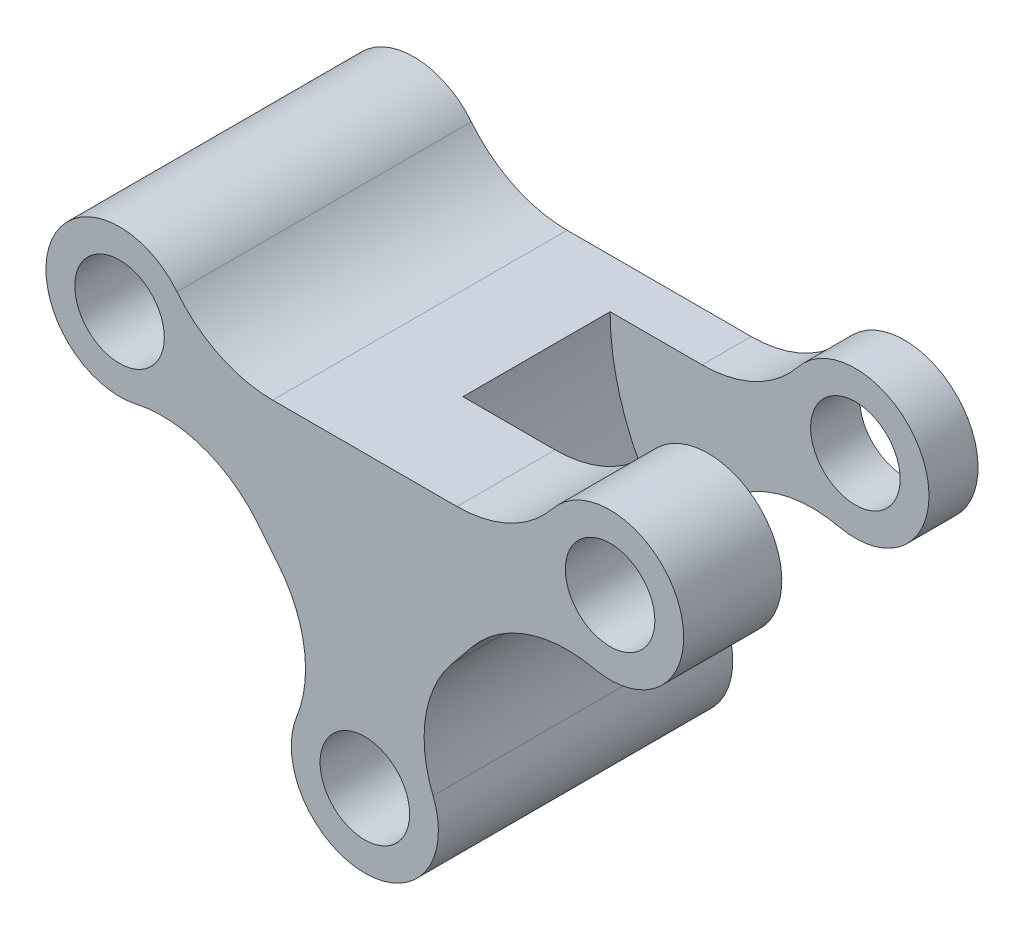
ISO-10303-21;
HEADER;
FILE_DESCRIPTION(('STEP AP214'),'2;1');
FILE_NAME('part.step','',(''),(''),'','','');
FILE_SCHEMA(('AUTOMOTIVE_DESIGN { 1 0 10303 214 1 1 1 1 }'));
ENDSEC;
DATA;
#1=APPLICATION_CONTEXT('core data for automotive mechanical design processes');
#2=APPLICATION_PROTOCOL_DEFINITION('international standard','automotive_design',2000,#1);
#3=PRODUCT_CONTEXT('',#1,'mechanical');
#4=PRODUCT('Part','Part','',(#3));
#5=PRODUCT_RELATED_PRODUCT_CATEGORY('part','',(#4));
#6=PRODUCT_DEFINITION_FORMATION('','',#4);
#7=PRODUCT_DEFINITION_CONTEXT('part definition',#1,'design');
#8=PRODUCT_DEFINITION('design','',#6,#7);
#9=PRODUCT_DEFINITION_SHAPE('','',#8);
#10=(LENGTH_UNIT() NAMED_UNIT(*) SI_UNIT(.MILLI.,.METRE.));
#11=(NAMED_UNIT(*) PLANE_ANGLE_UNIT() SI_UNIT($,.RADIAN.));
#12=(NAMED_UNIT(*) SI_UNIT($,.STERADIAN.) SOLID_ANGLE_UNIT());
#13=UNCERTAINTY_MEASURE_WITH_UNIT(LENGTH_MEASURE(1.E-05),#10,'distance_accuracy_value','');
#14=(GEOMETRIC_REPRESENTATION_CONTEXT(3) GLOBAL_UNCERTAINTY_ASSIGNED_CONTEXT((#13)) GLOBAL_UNIT_ASSIGNED_CONTEXT((#10,
#11,#12)) REPRESENTATION_CONTEXT('',''));
#15=CARTESIAN_POINT('',(0.,0.,0.));
#16=DIRECTION('',(0.,0.,1.));
#17=DIRECTION('',(1.,0.,0.));
#18=AXIS2_PLACEMENT_3D('',#15,#16,#17);
#19=CARTESIAN_POINT('',(2.45008972423379,-2.00294834956112,12.));
#20=DIRECTION('',(0.774215945384604,-0.632921535351914,0.));
#21=DIRECTION('',(0.632921535351914,0.774215945384604,0.));
#22=AXIS2_PLACEMENT_3D('',#19,#20,#21);
#23=PLANE('',#22);
#24=DIRECTION('',(-0.632921535351914,-0.774215945384604,0.));
#25=VECTOR('',#24,1.);
#26=CARTESIAN_POINT('',(2.45008972423379,-2.00294834956112,8.));
#27=LINE('',#26,#25);
#28=CARTESIAN_POINT('',(4.38022113462885,0.358068666212658,8.));
#29=VERTEX_POINT('',#28);
#30=CARTESIAN_POINT('',(3.54594958364345,-0.662446992485075,8.));
#31=VERTEX_POINT('',#30);
#32=EDGE_CURVE('E550',#29,#31,#27,.T.);
#33=ORIENTED_EDGE('',*,*,#32,.F.);
#34=DIRECTION('',(0.,0.,-1.));
#35=VECTOR('',#34,1.);
#36=CARTESIAN_POINT('',(4.38022113462885,0.358068666212658,12.));
#37=LINE('',#36,#35);
#38=CARTESIAN_POINT('',(4.38022113462885,0.358068666212658,12.));
#39=VERTEX_POINT('',#38);
#40=EDGE_CURVE('E430',#29,#39,#37,.F.);
#41=ORIENTED_EDGE('',*,*,#40,.T.);
#42=DIRECTION('',(-0.632921535351914,-0.774215945384604,0.));
#43=VECTOR('',#42,1.);
#44=CARTESIAN_POINT('',(2.45008972423379,-2.00294834956112,12.));
#45=LINE('',#44,#43);
#46=CARTESIAN_POINT('',(3.54594958364345,-0.662446992485075,12.));
#47=VERTEX_POINT('',#46);
#48=EDGE_CURVE('E521',#39,#47,#45,.T.);
#49=ORIENTED_EDGE('',*,*,#48,.T.);
#50=DIRECTION('',(0.,0.,-1.));
#51=VECTOR('',#50,1.);
#52=CARTESIAN_POINT('',(3.54594958364345,-0.662446992485075,12.));
#53=LINE('',#52,#51);
#54=EDGE_CURVE('E427',#47,#31,#53,.T.);
#55=ORIENTED_EDGE('',*,*,#54,.T.);
#56=EDGE_LOOP('',(#33,#41,#49,#55));
#57=FACE_BOUND('',#56,.T.);
#58=ADVANCED_FACE('F236',(#57),#23,.T.);
#59=CARTESIAN_POINT('',(10.,5.,12.));
#60=DIRECTION('',(0.,0.,-1.));
#61=DIRECTION('',(-1.,0.,0.));
#62=AXIS2_PLACEMENT_3D('',#59,#60,#61);
#63=CYLINDRICAL_SURFACE('',#62,1.825);
#64=CARTESIAN_POINT('',(10.,5.,0.));
#65=DIRECTION('',(0.,0.,1.));
#66=DIRECTION('',(1.,0.,0.));
#67=AXIS2_PLACEMENT_3D('',#64,#65,#66);
#68=CIRCLE('',#67,1.825);
#69=CARTESIAN_POINT('',(11.825,5.,0.));
#70=VERTEX_POINT('',#69);
#71=EDGE_CURVE('E511',#70,#70,#68,.T.);
#72=ORIENTED_EDGE('',*,*,#71,.F.);
#73=EDGE_LOOP('',(#72));
#74=FACE_BOUND('',#73,.T.);
#75=CARTESIAN_POINT('',(10.,5.,2.));
#76=DIRECTION('',(0.,0.,1.));
#77=DIRECTION('',(1.,0.,0.));
#78=AXIS2_PLACEMENT_3D('',#75,#76,#77);
#79=CIRCLE('',#78,1.825);
#80=CARTESIAN_POINT('',(11.825,5.,2.));
#81=VERTEX_POINT('',#80);
#82=EDGE_CURVE('E591',#81,#81,#79,.T.);
#83=ORIENTED_EDGE('',*,*,#82,.T.);
#84=EDGE_LOOP('',(#83));
#85=FACE_BOUND('',#84,.T.);
#86=ADVANCED_FACE('F619',(#74,#85),#63,.F.);
#87=CARTESIAN_POINT('',(10.,5.,12.));
#88=DIRECTION('',(0.,0.,-1.));
#89=DIRECTION('',(-1.,0.,0.));
#90=AXIS2_PLACEMENT_3D('',#87,#88,#89);
#91=CYLINDRICAL_SURFACE('',#90,3.);
#92=CARTESIAN_POINT('',(10.,5.,0.));
#93=DIRECTION('',(0.,0.,1.));
#94=DIRECTION('',(1.,0.,0.));
#95=AXIS2_PLACEMENT_3D('',#92,#93,#94);
#96=CIRCLE('',#95,3.);
#97=CARTESIAN_POINT('',(9.34423782308195,2.07254787104491,0.));
#98=VERTEX_POINT('',#97);
#99=CARTESIAN_POINT('',(7.6581257506006,6.875,0.));
#100=VERTEX_POINT('',#99);
#101=EDGE_CURVE('E475',#98,#100,#96,.T.);
#102=ORIENTED_EDGE('',*,*,#101,.T.);
#103=DIRECTION('',(0.,0.,-1.));
#104=VECTOR('',#103,1.);
#105=CARTESIAN_POINT('',(7.6581257506006,6.875,12.));
#106=LINE('',#105,#104);
#107=CARTESIAN_POINT('',(7.6581257506006,6.875,2.));
#108=VERTEX_POINT('',#107);
#109=EDGE_CURVE('E467',#100,#108,#106,.F.);
#110=ORIENTED_EDGE('',*,*,#109,.T.);
#111=CARTESIAN_POINT('',(10.,5.,2.));
#112=DIRECTION('',(0.,0.,1.));
#113=DIRECTION('',(1.,0.,0.));
#114=AXIS2_PLACEMENT_3D('',#111,#112,#113);
#115=CIRCLE('',#114,3.);
#116=CARTESIAN_POINT('',(9.34423782308195,2.07254787104491,2.));
#117=VERTEX_POINT('',#116);
#118=EDGE_CURVE('E399',#117,#108,#115,.T.);
#119=ORIENTED_EDGE('',*,*,#118,.F.);
#120=DIRECTION('',(0.,0.,-1.));
#121=VECTOR('',#120,1.);
#122=CARTESIAN_POINT('',(9.34423782308195,2.07254787104491,12.));
#123=LINE('',#122,#121);
#124=EDGE_CURVE('E464',#117,#98,#123,.T.);
#125=ORIENTED_EDGE('',*,*,#124,.T.);
#126=EDGE_LOOP('',(#102,#110,#119,#125));
#127=FACE_BOUND('',#126,.T.);
#128=ADVANCED_FACE('F481',(#127),#91,.T.);
#129=CARTESIAN_POINT('',(0.,0.,12.));
#130=DIRECTION('',(0.,0.,1.));
#131=DIRECTION('',(1.,0.,0.));
#132=AXIS2_PLACEMENT_3D('',#129,#130,#131);
#133=PLANE('',#132);
#134=CARTESIAN_POINT('',(-10.,5.,12.));
#135=DIRECTION('',(0.,0.,1.));
#136=DIRECTION('',(1.,0.,0.));
#137=AXIS2_PLACEMENT_3D('',#134,#135,#136);
#138=CIRCLE('',#137,1.825);
#139=CARTESIAN_POINT('',(-8.175,5.,12.));
#140=VERTEX_POINT('',#139);
#141=EDGE_CURVE('E516',#140,#140,#138,.T.);
#142=ORIENTED_EDGE('',*,*,#141,.F.);
#143=EDGE_LOOP('',(#142));
#144=FACE_BOUND('',#143,.T.);
#145=CARTESIAN_POINT('',(10.,5.,12.));
#146=DIRECTION('',(0.,0.,1.));
#147=DIRECTION('',(1.,0.,0.));
#148=AXIS2_PLACEMENT_3D('',#145,#146,#147);
#149=CIRCLE('',#148,1.825);
#150=CARTESIAN_POINT('',(11.825,5.,12.));
#151=VERTEX_POINT('',#150);
#152=EDGE_CURVE('E485',#151,#151,#149,.T.);
#153=ORIENTED_EDGE('',*,*,#152,.F.);
#154=EDGE_LOOP('',(#153));
#155=FACE_BOUND('',#154,.T.);
#156=CARTESIAN_POINT('',(0.,-6.825,12.));
#157=DIRECTION('',(0.,0.,1.));
#158=DIRECTION('',(1.,0.,0.));
#159=AXIS2_PLACEMENT_3D('',#156,#157,#158);
#160=CIRCLE('',#159,1.825);
#161=CARTESIAN_POINT('',(1.825,-6.825,12.));
#162=VERTEX_POINT('',#161);
#163=EDGE_CURVE('E491',#162,#162,#160,.T.);
#164=ORIENTED_EDGE('',*,*,#163,.F.);
#165=EDGE_LOOP('',(#164));
#166=FACE_BOUND('',#165,.T.);
#167=DIRECTION('',(-0.632921535351914,0.774215945384604,0.));
#168=VECTOR('',#167,1.);
#169=CARTESIAN_POINT('',(-2.45008972423379,-2.00294834956112,12.));
#170=LINE('',#169,#168);
#171=CARTESIAN_POINT('',(-3.54594958364345,-0.662446992485075,12.));
#172=VERTEX_POINT('',#171);
#173=CARTESIAN_POINT('',(-4.38022113462885,0.358068666212657,12.));
#174=VERTEX_POINT('',#173);
#175=EDGE_CURVE('E560',#172,#174,#170,.T.);
#176=ORIENTED_EDGE('',*,*,#175,.F.);
#177=CARTESIAN_POINT('',(-7.41702931056647,-3.82705466924464,12.));
#178=DIRECTION('',(0.,0.,1.));
#179=DIRECTION('',(1.,0.,0.));
#180=AXIS2_PLACEMENT_3D('',#177,#178,#179);
#181=CIRCLE('',#180,5.);
#182=CARTESIAN_POINT('',(-2.78138599146243,-5.70077050096674,12.));
#183=VERTEX_POINT('',#182);
#184=EDGE_CURVE('E442',#172,#183,#181,.F.);
#185=ORIENTED_EDGE('',*,*,#184,.T.);
#186=CARTESIAN_POINT('',(0.,-6.825,12.));
#187=DIRECTION('',(0.,0.,1.));
#188=DIRECTION('',(1.,0.,0.));
#189=AXIS2_PLACEMENT_3D('',#186,#187,#188);
#190=CIRCLE('',#189,3.);
#191=CARTESIAN_POINT('',(2.78138599146243,-5.70077050096674,12.));
#192=VERTEX_POINT('',#191);
#193=EDGE_CURVE('E525',#183,#192,#190,.T.);
#194=ORIENTED_EDGE('',*,*,#193,.T.);
#195=CARTESIAN_POINT('',(7.41702931056647,-3.82705466924464,12.));
#196=DIRECTION('',(0.,0.,1.));
#197=DIRECTION('',(1.,0.,0.));
#198=AXIS2_PLACEMENT_3D('',#195,#196,#197);
#199=CIRCLE('',#198,5.);
#200=EDGE_CURVE('E460',#192,#47,#199,.F.);
#201=ORIENTED_EDGE('',*,*,#200,.T.);
#202=ORIENTED_EDGE('',*,*,#48,.F.);
#203=CARTESIAN_POINT('',(8.25130086155187,-2.80653901054691,12.));
#204=DIRECTION('',(0.,0.,1.));
#205=DIRECTION('',(1.,0.,0.));
#206=AXIS2_PLACEMENT_3D('',#203,#204,#205);
#207=CIRCLE('',#206,5.);
#208=CARTESIAN_POINT('',(9.34423782308195,2.07254787104491,12.));
#209=VERTEX_POINT('',#208);
#210=EDGE_CURVE('E446',#39,#209,#207,.F.);
#211=ORIENTED_EDGE('',*,*,#210,.T.);
#212=CARTESIAN_POINT('',(10.,5.,12.));
#213=DIRECTION('',(0.,0.,1.));
#214=DIRECTION('',(1.,0.,0.));
#215=AXIS2_PLACEMENT_3D('',#212,#213,#214);
#216=CIRCLE('',#215,3.);
#217=CARTESIAN_POINT('',(7.6581257506006,6.875,12.));
#218=VERTEX_POINT('',#217);
#219=EDGE_CURVE('E484',#209,#218,#216,.T.);
#220=ORIENTED_EDGE('',*,*,#219,.T.);
#221=CARTESIAN_POINT('',(3.75500200160161,10.,12.));
#222=DIRECTION('',(0.,0.,1.));
#223=DIRECTION('',(1.,0.,0.));
#224=AXIS2_PLACEMENT_3D('',#221,#222,#223);
#225=CIRCLE('',#224,5.);
#226=CARTESIAN_POINT('',(3.75500200160161,5.,12.));
#227=VERTEX_POINT('',#226);
#228=EDGE_CURVE('E450',#218,#227,#225,.F.);
#229=ORIENTED_EDGE('',*,*,#228,.T.);
#230=DIRECTION('',(1.,0.,0.));
#231=VECTOR('',#230,1.);
#232=CARTESIAN_POINT('',(0.,5.,12.));
#233=LINE('',#232,#231);
#234=CARTESIAN_POINT('',(-3.7550020016016,5.,12.));
#235=VERTEX_POINT('',#234);
#236=EDGE_CURVE('E505',#235,#227,#233,.T.);
#237=ORIENTED_EDGE('',*,*,#236,.F.);
#238=CARTESIAN_POINT('',(-3.7550020016016,10.,12.));
#239=DIRECTION('',(0.,0.,1.));
#240=DIRECTION('',(1.,0.,0.));
#241=AXIS2_PLACEMENT_3D('',#238,#239,#240);
#242=CIRCLE('',#241,5.);
#243=CARTESIAN_POINT('',(-7.6581257506006,6.875,12.));
#244=VERTEX_POINT('',#243);
#245=EDGE_CURVE('E434',#235,#244,#242,.F.);
#246=ORIENTED_EDGE('',*,*,#245,.T.);
#247=CARTESIAN_POINT('',(-10.,5.,12.));
#248=DIRECTION('',(0.,0.,1.));
#249=DIRECTION('',(1.,0.,0.));
#250=AXIS2_PLACEMENT_3D('',#247,#248,#249);
#251=CIRCLE('',#250,3.);
#252=CARTESIAN_POINT('',(-9.34423782308195,2.07254787104491,12.));
#253=VERTEX_POINT('',#252);
#254=EDGE_CURVE('E503',#244,#253,#251,.T.);
#255=ORIENTED_EDGE('',*,*,#254,.T.);
#256=CARTESIAN_POINT('',(-8.25130086155187,-2.80653901054691,12.));
#257=DIRECTION('',(0.,0.,1.));
#258=DIRECTION('',(1.,0.,0.));
#259=AXIS2_PLACEMENT_3D('',#256,#257,#258);
#260=CIRCLE('',#259,5.);
#261=EDGE_CURVE('E438',#253,#174,#260,.F.);
#262=ORIENTED_EDGE('',*,*,#261,.T.);
#263=EDGE_LOOP('',(#176,#185,#194,#201,#202,#211,#220,#229,#237,#246,#255,#262));
#264=FACE_BOUND('',#263,.T.);
#265=ADVANCED_FACE('F502',(#144,#155,#166,#264),#133,.T.);
#266=CARTESIAN_POINT('',(0.,0.,0.));
#267=DIRECTION('',(0.,0.,1.));
#268=DIRECTION('',(1.,0.,0.));
#269=AXIS2_PLACEMENT_3D('',#266,#267,#268);
#270=PLANE('',#269);
#271=CARTESIAN_POINT('',(-10.,5.,0.));
#272=DIRECTION('',(0.,0.,1.));
#273=DIRECTION('',(1.,0.,0.));
#274=AXIS2_PLACEMENT_3D('',#271,#272,#273);
#275=CIRCLE('',#274,1.825);
#276=CARTESIAN_POINT('',(-8.175,5.,0.));
#277=VERTEX_POINT('',#276);
#278=EDGE_CURVE('E519',#277,#277,#275,.T.);
#279=ORIENTED_EDGE('',*,*,#278,.T.);
#280=EDGE_LOOP('',(#279));
#281=FACE_BOUND('',#280,.T.);
#282=ORIENTED_EDGE('',*,*,#71,.T.);
#283=EDGE_LOOP('',(#282));
#284=FACE_BOUND('',#283,.T.);
#285=CARTESIAN_POINT('',(0.,-6.825,0.));
#286=DIRECTION('',(0.,0.,1.));
#287=DIRECTION('',(1.,0.,0.));
#288=AXIS2_PLACEMENT_3D('',#285,#286,#287);
#289=CIRCLE('',#288,1.825);
#290=CARTESIAN_POINT('',(1.825,-6.825,0.));
#291=VERTEX_POINT('',#290);
#292=EDGE_CURVE('E529',#291,#291,#289,.T.);
#293=ORIENTED_EDGE('',*,*,#292,.T.);
#294=EDGE_LOOP('',(#293));
#295=FACE_BOUND('',#294,.T.);
#296=ORIENTED_EDGE('',*,*,#101,.F.);
#297=CARTESIAN_POINT('',(8.25130086155187,-2.80653901054691,0.));
#298=DIRECTION('',(0.,0.,1.));
#299=DIRECTION('',(1.,0.,0.));
#300=AXIS2_PLACEMENT_3D('',#297,#298,#299);
#301=CIRCLE('',#300,5.);
#302=CARTESIAN_POINT('',(4.38022113462885,0.358068666212658,0.));
#303=VERTEX_POINT('',#302);
#304=EDGE_CURVE('E244',#98,#303,#301,.T.);
#305=ORIENTED_EDGE('',*,*,#304,.T.);
#306=DIRECTION('',(-0.632921535351914,-0.774215945384604,0.));
#307=VECTOR('',#306,1.);
#308=CARTESIAN_POINT('',(2.45008972423379,-2.00294834956112,0.));
#309=LINE('',#308,#307);
#310=CARTESIAN_POINT('',(3.54594958364345,-0.662446992485075,0.));
#311=VERTEX_POINT('',#310);
#312=EDGE_CURVE('E492',#303,#311,#309,.T.);
#313=ORIENTED_EDGE('',*,*,#312,.T.);
#314=CARTESIAN_POINT('',(7.41702931056647,-3.82705466924464,0.));
#315=DIRECTION('',(0.,0.,1.));
#316=DIRECTION('',(1.,0.,0.));
#317=AXIS2_PLACEMENT_3D('',#314,#315,#316);
#318=CIRCLE('',#317,5.);
#319=CARTESIAN_POINT('',(2.78138599146243,-5.70077050096674,0.));
#320=VERTEX_POINT('',#319);
#321=EDGE_CURVE('E458',#311,#320,#318,.T.);
#322=ORIENTED_EDGE('',*,*,#321,.T.);
#323=CARTESIAN_POINT('',(0.,-6.825,0.));
#324=DIRECTION('',(0.,0.,1.));
#325=DIRECTION('',(1.,0.,0.));
#326=AXIS2_PLACEMENT_3D('',#323,#324,#325);
#327=CIRCLE('',#326,3.);
#328=CARTESIAN_POINT('',(-2.78138599146243,-5.70077050096674,0.));
#329=VERTEX_POINT('',#328);
#330=EDGE_CURVE('E535',#329,#320,#327,.T.);
#331=ORIENTED_EDGE('',*,*,#330,.F.);
#332=CARTESIAN_POINT('',(-7.41702931056647,-3.82705466924464,0.));
#333=DIRECTION('',(0.,0.,1.));
#334=DIRECTION('',(1.,0.,0.));
#335=AXIS2_PLACEMENT_3D('',#332,#333,#334);
#336=CIRCLE('',#335,5.);
#337=CARTESIAN_POINT('',(-3.54594958364345,-0.662446992485075,0.));
#338=VERTEX_POINT('',#337);
#339=EDGE_CURVE('E440',#329,#338,#336,.T.);
#340=ORIENTED_EDGE('',*,*,#339,.T.);
#341=DIRECTION('',(-0.632921535351914,0.774215945384604,0.));
#342=VECTOR('',#341,1.);
#343=CARTESIAN_POINT('',(-2.45008972423379,-2.00294834956112,0.));
#344=LINE('',#343,#342);
#345=CARTESIAN_POINT('',(-4.38022113462885,0.358068666212657,0.));
#346=VERTEX_POINT('',#345);
#347=EDGE_CURVE('E532',#338,#346,#344,.T.);
#348=ORIENTED_EDGE('',*,*,#347,.T.);
#349=CARTESIAN_POINT('',(-8.25130086155187,-2.80653901054691,0.));
#350=DIRECTION('',(0.,0.,1.));
#351=DIRECTION('',(1.,0.,0.));
#352=AXIS2_PLACEMENT_3D('',#349,#350,#351);
#353=CIRCLE('',#352,5.);
#354=CARTESIAN_POINT('',(-9.34423782308195,2.07254787104491,0.));
#355=VERTEX_POINT('',#354);
#356=EDGE_CURVE('E436',#346,#355,#353,.T.);
#357=ORIENTED_EDGE('',*,*,#356,.T.);
#358=CARTESIAN_POINT('',(-10.,5.,0.));
#359=DIRECTION('',(0.,0.,1.));
#360=DIRECTION('',(1.,0.,0.));
#361=AXIS2_PLACEMENT_3D('',#358,#359,#360);
#362=CIRCLE('',#361,3.);
#363=CARTESIAN_POINT('',(-7.6581257506006,6.875,0.));
#364=VERTEX_POINT('',#363);
#365=EDGE_CURVE('E512',#364,#355,#362,.T.);
#366=ORIENTED_EDGE('',*,*,#365,.F.);
#367=CARTESIAN_POINT('',(-3.7550020016016,10.,0.));
#368=DIRECTION('',(0.,0.,1.));
#369=DIRECTION('',(1.,0.,0.));
#370=AXIS2_PLACEMENT_3D('',#367,#368,#369);
#371=CIRCLE('',#370,5.);
#372=CARTESIAN_POINT('',(-3.7550020016016,5.,0.));
#373=VERTEX_POINT('',#372);
#374=EDGE_CURVE('E432',#364,#373,#371,.T.);
#375=ORIENTED_EDGE('',*,*,#374,.T.);
#376=DIRECTION('',(1.,0.,0.));
#377=VECTOR('',#376,1.);
#378=CARTESIAN_POINT('',(0.,5.,0.));
#379=LINE('',#378,#377);
#380=CARTESIAN_POINT('',(3.75500200160161,5.,0.));
#381=VERTEX_POINT('',#380);
#382=EDGE_CURVE('E477',#373,#381,#379,.T.);
#383=ORIENTED_EDGE('',*,*,#382,.T.);
#384=CARTESIAN_POINT('',(3.75500200160161,10.,0.));
#385=DIRECTION('',(0.,0.,1.));
#386=DIRECTION('',(1.,0.,0.));
#387=AXIS2_PLACEMENT_3D('',#384,#385,#386);
#388=CIRCLE('',#387,5.);
#389=EDGE_CURVE('E470',#381,#100,#388,.T.);
#390=ORIENTED_EDGE('',*,*,#389,.T.);
#391=EDGE_LOOP('',(#296,#305,#313,#322,#331,#340,#348,#357,#366,#375,#383,#390));
#392=FACE_BOUND('',#391,.T.);
#393=ADVANCED_FACE('F474',(#281,#284,#295,#392),#270,.F.);
#394=CARTESIAN_POINT('',(0.,-6.825,12.));
#395=DIRECTION('',(0.,0.,-1.));
#396=DIRECTION('',(-1.,0.,0.));
#397=AXIS2_PLACEMENT_3D('',#394,#395,#396);
#398=CYLINDRICAL_SURFACE('',#397,1.825);
#399=ORIENTED_EDGE('',*,*,#292,.F.);
#400=EDGE_LOOP('',(#399));
#401=FACE_BOUND('',#400,.T.);
#402=ORIENTED_EDGE('',*,*,#163,.T.);
#403=EDGE_LOOP('',(#402));
#404=FACE_BOUND('',#403,.T.);
#405=ADVANCED_FACE('F635',(#401,#404),#398,.F.);
#406=CARTESIAN_POINT('',(0.,-6.825,12.));
#407=DIRECTION('',(0.,0.,-1.));
#408=DIRECTION('',(-1.,0.,0.));
#409=AXIS2_PLACEMENT_3D('',#406,#407,#408);
#410=CYLINDRICAL_SURFACE('',#409,3.);
#411=ORIENTED_EDGE('',*,*,#193,.F.);
#412=DIRECTION('',(0.,0.,-1.));
#413=VECTOR('',#412,1.);
#414=CARTESIAN_POINT('',(-2.78138599146243,-5.70077050096674,12.));
#415=LINE('',#414,#413);
#416=EDGE_CURVE('E416',#183,#329,#415,.T.);
#417=ORIENTED_EDGE('',*,*,#416,.T.);
#418=ORIENTED_EDGE('',*,*,#330,.T.);
#419=DIRECTION('',(0.,0.,-1.));
#420=VECTOR('',#419,1.);
#421=CARTESIAN_POINT('',(2.78138599146243,-5.70077050096674,12.));
#422=LINE('',#421,#420);
#423=EDGE_CURVE('E414',#320,#192,#422,.F.);
#424=ORIENTED_EDGE('',*,*,#423,.T.);
#425=EDGE_LOOP('',(#411,#417,#418,#424));
#426=FACE_BOUND('',#425,.T.);
#427=ADVANCED_FACE('F600',(#426),#410,.T.);
#428=ORIENTED_EDGE('',*,*,#312,.F.);
#429=DIRECTION('',(0.,0.,-1.));
#430=VECTOR('',#429,1.);
#431=CARTESIAN_POINT('',(4.38022113462885,0.358068666212658,12.));
#432=LINE('',#431,#430);
#433=CARTESIAN_POINT('',(4.38022113462885,0.358068666212658,2.));
#434=VERTEX_POINT('',#433);
#435=EDGE_CURVE('E257',#303,#434,#432,.F.);
#436=ORIENTED_EDGE('',*,*,#435,.T.);
#437=DIRECTION('',(-0.632921535351914,-0.774215945384604,0.));
#438=VECTOR('',#437,1.);
#439=CARTESIAN_POINT('',(2.45008972423379,-2.00294834956112,2.));
#440=LINE('',#439,#438);
#441=CARTESIAN_POINT('',(3.54594958364345,-0.662446992485075,2.));
#442=VERTEX_POINT('',#441);
#443=EDGE_CURVE('E377',#434,#442,#440,.T.);
#444=ORIENTED_EDGE('',*,*,#443,.T.);
#445=DIRECTION('',(0.,0.,-1.));
#446=VECTOR('',#445,1.);
#447=CARTESIAN_POINT('',(3.54594958364345,-0.662446992485075,12.));
#448=LINE('',#447,#446);
#449=EDGE_CURVE('E424',#442,#311,#448,.T.);
#450=ORIENTED_EDGE('',*,*,#449,.T.);
#451=EDGE_LOOP('',(#428,#436,#444,#450));
#452=FACE_BOUND('',#451,.T.);
#453=ADVANCED_FACE('F596',(#452),#23,.T.);
#454=CARTESIAN_POINT('',(0.,5.,12.));
#455=DIRECTION('',(0.,1.,0.));
#456=DIRECTION('',(-1.,0.,0.));
#457=AXIS2_PLACEMENT_3D('',#454,#455,#456);
#458=PLANE('',#457);
#459=DIRECTION('',(1.,0.,0.));
#460=VECTOR('',#459,1.);
#461=CARTESIAN_POINT('',(0.,5.,2.));
#462=LINE('',#461,#460);
#463=CARTESIAN_POINT('',(0.,5.,2.));
#464=VERTEX_POINT('',#463);
#465=CARTESIAN_POINT('',(3.75500200160161,5.,2.));
#466=VERTEX_POINT('',#465);
#467=EDGE_CURVE('E364',#464,#466,#462,.T.);
#468=ORIENTED_EDGE('',*,*,#467,.T.);
#469=DIRECTION('',(0.,0.,-1.));
#470=VECTOR('',#469,1.);
#471=CARTESIAN_POINT('',(3.75500200160161,5.,12.));
#472=LINE('',#471,#470);
#473=EDGE_CURVE('E462',#466,#381,#472,.T.);
#474=ORIENTED_EDGE('',*,*,#473,.T.);
#475=ORIENTED_EDGE('',*,*,#382,.F.);
#476=DIRECTION('',(0.,0.,-1.));
#477=VECTOR('',#476,1.);
#478=CARTESIAN_POINT('',(-3.7550020016016,5.,12.));
#479=LINE('',#478,#477);
#480=EDGE_CURVE('E407',#373,#235,#479,.F.);
#481=ORIENTED_EDGE('',*,*,#480,.T.);
#482=ORIENTED_EDGE('',*,*,#236,.T.);
#483=DIRECTION('',(0.,0.,-1.));
#484=VECTOR('',#483,1.);
#485=CARTESIAN_POINT('',(3.75500200160161,5.,12.));
#486=LINE('',#485,#484);
#487=CARTESIAN_POINT('',(3.75500200160161,5.,8.));
#488=VERTEX_POINT('',#487);
#489=EDGE_CURVE('E405',#227,#488,#486,.T.);
#490=ORIENTED_EDGE('',*,*,#489,.T.);
#491=DIRECTION('',(1.,0.,0.));
#492=VECTOR('',#491,1.);
#493=CARTESIAN_POINT('',(0.,5.,8.));
#494=LINE('',#493,#492);
#495=CARTESIAN_POINT('',(0.,5.,8.));
#496=VERTEX_POINT('',#495);
#497=EDGE_CURVE('E392',#496,#488,#494,.T.);
#498=ORIENTED_EDGE('',*,*,#497,.F.);
#499=DIRECTION('',(0.,0.,-1.));
#500=VECTOR('',#499,1.);
#501=CARTESIAN_POINT('',(0.,5.,8.));
#502=LINE('',#501,#500);
#503=EDGE_CURVE('E382',#496,#464,#502,.T.);
#504=ORIENTED_EDGE('',*,*,#503,.T.);
#505=EDGE_LOOP('',(#468,#474,#475,#481,#482,#490,#498,#504));
#506=FACE_BOUND('',#505,.T.);
#507=ADVANCED_FACE('F389',(#506),#458,.T.);
#508=CARTESIAN_POINT('',(-2.45008972423379,-2.00294834956112,12.));
#509=DIRECTION('',(-0.774215945384604,-0.632921535351914,0.));
#510=DIRECTION('',(0.632921535351914,-0.774215945384604,0.));
#511=AXIS2_PLACEMENT_3D('',#508,#509,#510);
#512=PLANE('',#511);
#513=ORIENTED_EDGE('',*,*,#175,.T.);
#514=DIRECTION('',(0.,0.,-1.));
#515=VECTOR('',#514,1.);
#516=CARTESIAN_POINT('',(-4.38022113462885,0.358068666212657,12.));
#517=LINE('',#516,#515);
#518=EDGE_CURVE('E411',#174,#346,#517,.T.);
#519=ORIENTED_EDGE('',*,*,#518,.T.);
#520=ORIENTED_EDGE('',*,*,#347,.F.);
#521=DIRECTION('',(0.,0.,-1.));
#522=VECTOR('',#521,1.);
#523=CARTESIAN_POINT('',(-3.54594958364345,-0.662446992485075,12.));
#524=LINE('',#523,#522);
#525=EDGE_CURVE('E409',#338,#172,#524,.F.);
#526=ORIENTED_EDGE('',*,*,#525,.T.);
#527=EDGE_LOOP('',(#513,#519,#520,#526));
#528=FACE_BOUND('',#527,.T.);
#529=ADVANCED_FACE('F606',(#528),#512,.T.);
#530=CARTESIAN_POINT('',(10.,5.,8.));
#531=DIRECTION('',(0.,0.,1.));
#532=DIRECTION('',(1.,0.,0.));
#533=AXIS2_PLACEMENT_3D('',#530,#531,#532);
#534=CIRCLE('',#533,1.825);
#535=CARTESIAN_POINT('',(11.825,5.,8.));
#536=VERTEX_POINT('',#535);
#537=EDGE_CURVE('E546',#536,#536,#534,.T.);
#538=ORIENTED_EDGE('',*,*,#537,.F.);
#539=EDGE_LOOP('',(#538));
#540=FACE_BOUND('',#539,.T.);
#541=ORIENTED_EDGE('',*,*,#152,.T.);
#542=EDGE_LOOP('',(#541));
#543=FACE_BOUND('',#542,.T.);
#544=ADVANCED_FACE('F626',(#540,#543),#63,.F.);
#545=ORIENTED_EDGE('',*,*,#219,.F.);
#546=DIRECTION('',(0.,0.,-1.));
#547=VECTOR('',#546,1.);
#548=CARTESIAN_POINT('',(9.34423782308195,2.07254787104491,12.));
#549=LINE('',#548,#547);
#550=CARTESIAN_POINT('',(9.34423782308195,2.07254787104491,8.));
#551=VERTEX_POINT('',#550);
#552=EDGE_CURVE('E421',#209,#551,#549,.T.);
#553=ORIENTED_EDGE('',*,*,#552,.T.);
#554=CARTESIAN_POINT('',(10.,5.,8.));
#555=DIRECTION('',(0.,0.,1.));
#556=DIRECTION('',(1.,0.,0.));
#557=AXIS2_PLACEMENT_3D('',#554,#555,#556);
#558=CIRCLE('',#557,3.);
#559=CARTESIAN_POINT('',(7.6581257506006,6.875,8.));
#560=VERTEX_POINT('',#559);
#561=EDGE_CURVE('E394',#551,#560,#558,.T.);
#562=ORIENTED_EDGE('',*,*,#561,.T.);
#563=DIRECTION('',(0.,0.,-1.));
#564=VECTOR('',#563,1.);
#565=CARTESIAN_POINT('',(7.6581257506006,6.875,12.));
#566=LINE('',#565,#564);
#567=EDGE_CURVE('E419',#560,#218,#566,.F.);
#568=ORIENTED_EDGE('',*,*,#567,.T.);
#569=EDGE_LOOP('',(#545,#553,#562,#568));
#570=FACE_BOUND('',#569,.T.);
#571=ADVANCED_FACE('F586',(#570),#91,.T.);
#572=CARTESIAN_POINT('',(-10.,5.,12.));
#573=DIRECTION('',(0.,0.,-1.));
#574=DIRECTION('',(-1.,0.,0.));
#575=AXIS2_PLACEMENT_3D('',#572,#573,#574);
#576=CYLINDRICAL_SURFACE('',#575,1.825);
#577=ORIENTED_EDGE('',*,*,#278,.F.);
#578=EDGE_LOOP('',(#577));
#579=FACE_BOUND('',#578,.T.);
#580=ORIENTED_EDGE('',*,*,#141,.T.);
#581=EDGE_LOOP('',(#580));
#582=FACE_BOUND('',#581,.T.);
#583=ADVANCED_FACE('F634',(#579,#582),#576,.F.);
#584=CARTESIAN_POINT('',(-10.,5.,12.));
#585=DIRECTION('',(0.,0.,-1.));
#586=DIRECTION('',(-1.,0.,0.));
#587=AXIS2_PLACEMENT_3D('',#584,#585,#586);
#588=CYLINDRICAL_SURFACE('',#587,3.);
#589=ORIENTED_EDGE('',*,*,#254,.F.);
#590=DIRECTION('',(0.,0.,-1.));
#591=VECTOR('',#590,1.);
#592=CARTESIAN_POINT('',(-7.6581257506006,6.875,12.));
#593=LINE('',#592,#591);
#594=EDGE_CURVE('E396',#244,#364,#593,.T.);
#595=ORIENTED_EDGE('',*,*,#594,.T.);
#596=ORIENTED_EDGE('',*,*,#365,.T.);
#597=DIRECTION('',(0.,0.,-1.));
#598=VECTOR('',#597,1.);
#599=CARTESIAN_POINT('',(-9.34423782308195,2.07254787104491,12.));
#600=LINE('',#599,#598);
#601=EDGE_CURVE('E393',#355,#253,#600,.F.);
#602=ORIENTED_EDGE('',*,*,#601,.T.);
#603=EDGE_LOOP('',(#589,#595,#596,#602));
#604=FACE_BOUND('',#603,.T.);
#605=ADVANCED_FACE('F507',(#604),#588,.T.);
#606=CARTESIAN_POINT('',(10.,5.,8.));
#607=DIRECTION('',(0.,0.,-1.));
#608=DIRECTION('',(-1.,0.,0.));
#609=AXIS2_PLACEMENT_3D('',#606,#607,#608);
#610=CYLINDRICAL_SURFACE('',#609,10.);
#611=CARTESIAN_POINT('',(10.,5.,2.));
#612=DIRECTION('',(0.,0.,1.));
#613=DIRECTION('',(1.,0.,0.));
#614=AXIS2_PLACEMENT_3D('',#611,#612,#613);
#615=CIRCLE('',#614,10.);
#616=CARTESIAN_POINT('',(2.79080909558462,-1.93019238576351,2.));
#617=VERTEX_POINT('',#616);
#618=EDGE_CURVE('E368',#464,#617,#615,.T.);
#619=ORIENTED_EDGE('',*,*,#618,.F.);
#620=ORIENTED_EDGE('',*,*,#503,.F.);
#621=CARTESIAN_POINT('',(10.,5.,8.));
#622=DIRECTION('',(0.,0.,1.));
#623=DIRECTION('',(1.,0.,0.));
#624=AXIS2_PLACEMENT_3D('',#621,#622,#623);
#625=CIRCLE('',#624,10.);
#626=CARTESIAN_POINT('',(2.79080909558462,-1.93019238576351,8.));
#627=VERTEX_POINT('',#626);
#628=EDGE_CURVE('E378',#496,#627,#625,.T.);
#629=ORIENTED_EDGE('',*,*,#628,.T.);
#630=DIRECTION('',(0.,0.,-1.));
#631=VECTOR('',#630,1.);
#632=CARTESIAN_POINT('',(2.79080909558462,-1.93019238576351,8.));
#633=LINE('',#632,#631);
#634=EDGE_CURVE('E385',#627,#617,#633,.T.);
#635=ORIENTED_EDGE('',*,*,#634,.T.);
#636=EDGE_LOOP('',(#619,#620,#629,#635));
#637=FACE_BOUND('',#636,.T.);
#638=ADVANCED_FACE('F381',(#637),#610,.F.);
#639=CARTESIAN_POINT('',(10.,5.,8.));
#640=DIRECTION('',(0.,0.,1.));
#641=DIRECTION('',(1.,0.,0.));
#642=AXIS2_PLACEMENT_3D('',#639,#640,#641);
#643=PLANE('',#642);
#644=ORIENTED_EDGE('',*,*,#537,.T.);
#645=EDGE_LOOP('',(#644));
#646=FACE_BOUND('',#645,.T.);
#647=ORIENTED_EDGE('',*,*,#561,.F.);
#648=CARTESIAN_POINT('',(8.25130086155187,-2.80653901054691,8.));
#649=DIRECTION('',(0.,0.,1.));
#650=DIRECTION('',(1.,0.,0.));
#651=AXIS2_PLACEMENT_3D('',#648,#649,#650);
#652=CIRCLE('',#651,5.);
#653=EDGE_CURVE('E444',#551,#29,#652,.T.);
#654=ORIENTED_EDGE('',*,*,#653,.T.);
#655=ORIENTED_EDGE('',*,*,#32,.T.);
#656=CARTESIAN_POINT('',(7.41702931056647,-3.82705466924464,8.));
#657=DIRECTION('',(0.,0.,1.));
#658=DIRECTION('',(1.,0.,0.));
#659=AXIS2_PLACEMENT_3D('',#656,#657,#658);
#660=CIRCLE('',#659,5.);
#661=EDGE_CURVE('E452',#31,#627,#660,.T.);
#662=ORIENTED_EDGE('',*,*,#661,.T.);
#663=ORIENTED_EDGE('',*,*,#628,.F.);
#664=ORIENTED_EDGE('',*,*,#497,.T.);
#665=CARTESIAN_POINT('',(3.75500200160161,10.,8.));
#666=DIRECTION('',(0.,0.,1.));
#667=DIRECTION('',(1.,0.,0.));
#668=AXIS2_PLACEMENT_3D('',#665,#666,#667);
#669=CIRCLE('',#668,5.);
#670=EDGE_CURVE('E448',#488,#560,#669,.T.);
#671=ORIENTED_EDGE('',*,*,#670,.T.);
#672=EDGE_LOOP('',(#647,#654,#655,#662,#663,#664,#671));
#673=FACE_BOUND('',#672,.T.);
#674=ADVANCED_FACE('F579',(#646,#673),#643,.F.);
#675=CARTESIAN_POINT('',(10.,5.,2.));
#676=DIRECTION('',(0.,0.,1.));
#677=DIRECTION('',(1.,0.,0.));
#678=AXIS2_PLACEMENT_3D('',#675,#676,#677);
#679=PLANE('',#678);
#680=ORIENTED_EDGE('',*,*,#82,.F.);
#681=EDGE_LOOP('',(#680));
#682=FACE_BOUND('',#681,.T.);
#683=ORIENTED_EDGE('',*,*,#443,.F.);
#684=CARTESIAN_POINT('',(8.25130086155187,-2.80653901054691,2.));
#685=DIRECTION('',(0.,0.,1.));
#686=DIRECTION('',(1.,0.,0.));
#687=AXIS2_PLACEMENT_3D('',#684,#685,#686);
#688=CIRCLE('',#687,5.);
#689=EDGE_CURVE('E12',#434,#117,#688,.F.);
#690=ORIENTED_EDGE('',*,*,#689,.T.);
#691=ORIENTED_EDGE('',*,*,#118,.T.);
#692=CARTESIAN_POINT('',(3.75500200160161,10.,2.));
#693=DIRECTION('',(0.,0.,1.));
#694=DIRECTION('',(1.,0.,0.));
#695=AXIS2_PLACEMENT_3D('',#692,#693,#694);
#696=CIRCLE('',#695,5.);
#697=EDGE_CURVE('E372',#108,#466,#696,.F.);
#698=ORIENTED_EDGE('',*,*,#697,.T.);
#699=ORIENTED_EDGE('',*,*,#467,.F.);
#700=ORIENTED_EDGE('',*,*,#618,.T.);
#701=CARTESIAN_POINT('',(7.41702931056647,-3.82705466924464,2.));
#702=DIRECTION('',(0.,0.,1.));
#703=DIRECTION('',(1.,0.,0.));
#704=AXIS2_PLACEMENT_3D('',#701,#702,#703);
#705=CIRCLE('',#704,5.);
#706=EDGE_CURVE('E456',#617,#442,#705,.F.);
#707=ORIENTED_EDGE('',*,*,#706,.T.);
#708=EDGE_LOOP('',(#683,#690,#691,#698,#699,#700,#707));
#709=FACE_BOUND('',#708,.T.);
#710=ADVANCED_FACE('F366',(#682,#709),#679,.T.);
#711=CARTESIAN_POINT('',(-3.7550020016016,10.,12.));
#712=DIRECTION('',(0.,0.,-1.));
#713=DIRECTION('',(-1.,0.,0.));
#714=AXIS2_PLACEMENT_3D('',#711,#712,#713);
#715=CYLINDRICAL_SURFACE('',#714,5.);
#716=ORIENTED_EDGE('',*,*,#245,.F.);
#717=ORIENTED_EDGE('',*,*,#480,.F.);
#718=ORIENTED_EDGE('',*,*,#374,.F.);
#719=ORIENTED_EDGE('',*,*,#594,.F.);
#720=EDGE_LOOP('',(#716,#717,#718,#719));
#721=FACE_BOUND('',#720,.T.);
#722=ADVANCED_FACE('F496',(#721),#715,.F.);
#723=CARTESIAN_POINT('',(-8.25130086155187,-2.80653901054691,12.));
#724=DIRECTION('',(0.,0.,-1.));
#725=DIRECTION('',(-1.,0.,0.));
#726=AXIS2_PLACEMENT_3D('',#723,#724,#725);
#727=CYLINDRICAL_SURFACE('',#726,5.);
#728=ORIENTED_EDGE('',*,*,#261,.F.);
#729=ORIENTED_EDGE('',*,*,#601,.F.);
#730=ORIENTED_EDGE('',*,*,#356,.F.);
#731=ORIENTED_EDGE('',*,*,#518,.F.);
#732=EDGE_LOOP('',(#728,#729,#730,#731));
#733=FACE_BOUND('',#732,.T.);
#734=ADVANCED_FACE('F609',(#733),#727,.F.);
#735=CARTESIAN_POINT('',(-7.41702931056647,-3.82705466924464,12.));
#736=DIRECTION('',(0.,0.,-1.));
#737=DIRECTION('',(-1.,0.,0.));
#738=AXIS2_PLACEMENT_3D('',#735,#736,#737);
#739=CYLINDRICAL_SURFACE('',#738,5.);
#740=ORIENTED_EDGE('',*,*,#184,.F.);
#741=ORIENTED_EDGE('',*,*,#525,.F.);
#742=ORIENTED_EDGE('',*,*,#339,.F.);
#743=ORIENTED_EDGE('',*,*,#416,.F.);
#744=EDGE_LOOP('',(#740,#741,#742,#743));
#745=FACE_BOUND('',#744,.T.);
#746=ADVANCED_FACE('F602',(#745),#739,.F.);
#747=CARTESIAN_POINT('',(8.25130086155187,-2.80653901054691,12.));
#748=DIRECTION('',(0.,0.,-1.));
#749=DIRECTION('',(-1.,0.,0.));
#750=AXIS2_PLACEMENT_3D('',#747,#748,#749);
#751=CYLINDRICAL_SURFACE('',#750,5.);
#752=ORIENTED_EDGE('',*,*,#210,.F.);
#753=ORIENTED_EDGE('',*,*,#40,.F.);
#754=ORIENTED_EDGE('',*,*,#653,.F.);
#755=ORIENTED_EDGE('',*,*,#552,.F.);
#756=EDGE_LOOP('',(#752,#753,#754,#755));
#757=FACE_BOUND('',#756,.T.);
#758=ADVANCED_FACE('F583',(#757),#751,.F.);
#759=CARTESIAN_POINT('',(3.75500200160161,10.,12.));
#760=DIRECTION('',(0.,0.,-1.));
#761=DIRECTION('',(-1.,0.,0.));
#762=AXIS2_PLACEMENT_3D('',#759,#760,#761);
#763=CYLINDRICAL_SURFACE('',#762,5.);
#764=ORIENTED_EDGE('',*,*,#228,.F.);
#765=ORIENTED_EDGE('',*,*,#567,.F.);
#766=ORIENTED_EDGE('',*,*,#670,.F.);
#767=ORIENTED_EDGE('',*,*,#489,.F.);
#768=EDGE_LOOP('',(#764,#765,#766,#767));
#769=FACE_BOUND('',#768,.T.);
#770=ADVANCED_FACE('F590',(#769),#763,.F.);
#771=CARTESIAN_POINT('',(7.41702931056647,-3.82705466924464,12.));
#772=DIRECTION('',(0.,0.,-1.));
#773=DIRECTION('',(-1.,0.,0.));
#774=AXIS2_PLACEMENT_3D('',#771,#772,#773);
#775=CYLINDRICAL_SURFACE('',#774,5.);
#776=ORIENTED_EDGE('',*,*,#200,.F.);
#777=ORIENTED_EDGE('',*,*,#423,.F.);
#778=ORIENTED_EDGE('',*,*,#321,.F.);
#779=ORIENTED_EDGE('',*,*,#449,.F.);
#780=ORIENTED_EDGE('',*,*,#706,.F.);
#781=ORIENTED_EDGE('',*,*,#634,.F.);
#782=ORIENTED_EDGE('',*,*,#661,.F.);
#783=ORIENTED_EDGE('',*,*,#54,.F.);
#784=EDGE_LOOP('',(#776,#777,#778,#779,#780,#781,#782,#783));
#785=FACE_BOUND('',#784,.T.);
#786=ADVANCED_FACE('F572',(#785),#775,.F.);
#787=CARTESIAN_POINT('',(3.75500200160161,10.,12.));
#788=DIRECTION('',(0.,0.,-1.));
#789=DIRECTION('',(-1.,0.,0.));
#790=AXIS2_PLACEMENT_3D('',#787,#788,#789);
#791=CYLINDRICAL_SURFACE('',#790,5.);
#792=ORIENTED_EDGE('',*,*,#697,.F.);
#793=ORIENTED_EDGE('',*,*,#109,.F.);
#794=ORIENTED_EDGE('',*,*,#389,.F.);
#795=ORIENTED_EDGE('',*,*,#473,.F.);
#796=EDGE_LOOP('',(#792,#793,#794,#795));
#797=FACE_BOUND('',#796,.T.);
#798=ADVANCED_FACE('F487',(#797),#791,.F.);
#799=CARTESIAN_POINT('',(8.25130086155187,-2.80653901054691,12.));
#800=DIRECTION('',(0.,0.,-1.));
#801=DIRECTION('',(-1.,0.,0.));
#802=AXIS2_PLACEMENT_3D('',#799,#800,#801);
#803=CYLINDRICAL_SURFACE('',#802,5.);
#804=ORIENTED_EDGE('',*,*,#689,.F.);
#805=ORIENTED_EDGE('',*,*,#435,.F.);
#806=ORIENTED_EDGE('',*,*,#304,.F.);
#807=ORIENTED_EDGE('',*,*,#124,.F.);
#808=EDGE_LOOP('',(#804,#805,#806,#807));
#809=FACE_BOUND('',#808,.T.);
#810=ADVANCED_FACE('F238',(#809),#803,.F.);
#811=CLOSED_SHELL('',(#58,#86,#128,#265,#393,#405,#427,#453,#507,#529,#544,#571,#583,#605,#638,
#674,#710,#722,#734,#746,#758,#770,#786,#798,#810));
#812=MANIFOLD_SOLID_BREP('B2',#811);
#813=ADVANCED_BREP_SHAPE_REPRESENTATION('',(#18,#812),#14);
#814=SHAPE_DEFINITION_REPRESENTATION(#9,#813);
ENDSEC;
END-ISO-10303-21;
